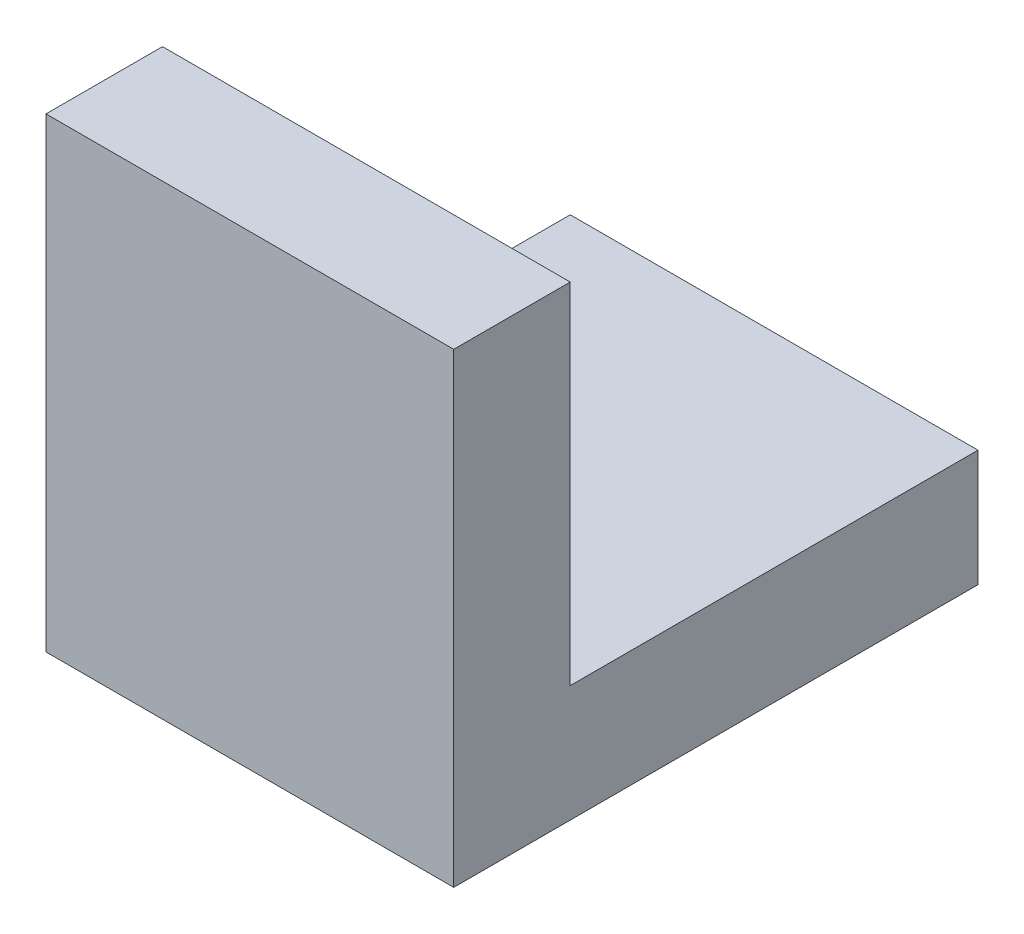
ISO-10303-21;
HEADER;
FILE_DESCRIPTION(('STEP AP214'),'2;1');
FILE_NAME('part.step','',(''),(''),'','','');
FILE_SCHEMA(('AUTOMOTIVE_DESIGN { 1 0 10303 214 1 1 1 1 }'));
ENDSEC;
DATA;
#1=APPLICATION_CONTEXT('core data for automotive mechanical design processes');
#2=APPLICATION_PROTOCOL_DEFINITION('international standard','automotive_design',2000,#1);
#3=PRODUCT_CONTEXT('',#1,'mechanical');
#4=PRODUCT('Part','Part','',(#3));
#5=PRODUCT_RELATED_PRODUCT_CATEGORY('part','',(#4));
#6=PRODUCT_DEFINITION_FORMATION('','',#4);
#7=PRODUCT_DEFINITION_CONTEXT('part definition',#1,'design');
#8=PRODUCT_DEFINITION('design','',#6,#7);
#9=PRODUCT_DEFINITION_SHAPE('','',#8);
#10=(LENGTH_UNIT() NAMED_UNIT(*) SI_UNIT(.MILLI.,.METRE.));
#11=(NAMED_UNIT(*) PLANE_ANGLE_UNIT() SI_UNIT($,.RADIAN.));
#12=(NAMED_UNIT(*) SI_UNIT($,.STERADIAN.) SOLID_ANGLE_UNIT());
#13=UNCERTAINTY_MEASURE_WITH_UNIT(LENGTH_MEASURE(1.E-05),#10,'distance_accuracy_value','');
#14=(GEOMETRIC_REPRESENTATION_CONTEXT(3) GLOBAL_UNCERTAINTY_ASSIGNED_CONTEXT((#13)) GLOBAL_UNIT_ASSIGNED_CONTEXT((#10,
#11,#12)) REPRESENTATION_CONTEXT('',''));
#15=CARTESIAN_POINT('',(0.,0.,0.));
#16=DIRECTION('',(0.,0.,1.));
#17=DIRECTION('',(1.,0.,0.));
#18=AXIS2_PLACEMENT_3D('',#15,#16,#17);
#19=CARTESIAN_POINT('',(7000.,0.,0.));
#20=DIRECTION('',(0.,1.,0.));
#21=DIRECTION('',(0.,0.,1.));
#22=AXIS2_PLACEMENT_3D('',#19,#20,#21);
#23=PLANE('',#22);
#24=DIRECTION('',(0.,0.,-1.));
#25=VECTOR('',#24,1.);
#26=CARTESIAN_POINT('',(0.,0.,0.));
#27=LINE('',#26,#25);
#28=CARTESIAN_POINT('',(0.,0.,0.));
#29=VERTEX_POINT('',#28);
#30=CARTESIAN_POINT('',(0.,0.,-9000.));
#31=VERTEX_POINT('',#30);
#32=EDGE_CURVE('E121',#29,#31,#27,.T.);
#33=ORIENTED_EDGE('',*,*,#32,.T.);
#34=DIRECTION('',(-1.,0.,0.));
#35=VECTOR('',#34,1.);
#36=CARTESIAN_POINT('',(7000.,0.,-9000.));
#37=LINE('',#36,#35);
#38=CARTESIAN_POINT('',(7000.,0.,-9000.));
#39=VERTEX_POINT('',#38);
#40=EDGE_CURVE('E11',#39,#31,#37,.T.);
#41=ORIENTED_EDGE('',*,*,#40,.F.);
#42=DIRECTION('',(0.,0.,-1.));
#43=VECTOR('',#42,1.);
#44=CARTESIAN_POINT('',(7000.,0.,0.));
#45=LINE('',#44,#43);
#46=CARTESIAN_POINT('',(7000.,0.,0.));
#47=VERTEX_POINT('',#46);
#48=EDGE_CURVE('E131',#47,#39,#45,.T.);
#49=ORIENTED_EDGE('',*,*,#48,.F.);
#50=DIRECTION('',(-1.,0.,0.));
#51=VECTOR('',#50,1.);
#52=CARTESIAN_POINT('',(7000.,0.,0.));
#53=LINE('',#52,#51);
#54=EDGE_CURVE('E117',#47,#29,#53,.T.);
#55=ORIENTED_EDGE('',*,*,#54,.T.);
#56=EDGE_LOOP('',(#33,#41,#49,#55));
#57=FACE_BOUND('',#56,.T.);
#58=ADVANCED_FACE('F37',(#57),#23,.F.);
#59=CARTESIAN_POINT('',(7000.,0.,-9000.));
#60=DIRECTION('',(0.,0.,1.));
#61=DIRECTION('',(1.,0.,0.));
#62=AXIS2_PLACEMENT_3D('',#59,#60,#61);
#63=PLANE('',#62);
#64=DIRECTION('',(0.,1.,0.));
#65=VECTOR('',#64,1.);
#66=CARTESIAN_POINT('',(0.,0.,-9000.));
#67=LINE('',#66,#65);
#68=CARTESIAN_POINT('',(0.,2000.,-9000.));
#69=VERTEX_POINT('',#68);
#70=EDGE_CURVE('E124',#31,#69,#67,.T.);
#71=ORIENTED_EDGE('',*,*,#70,.T.);
#72=DIRECTION('',(-1.,0.,0.));
#73=VECTOR('',#72,1.);
#74=CARTESIAN_POINT('',(7000.,2000.,-9000.));
#75=LINE('',#74,#73);
#76=CARTESIAN_POINT('',(7000.,2000.,-9000.));
#77=VERTEX_POINT('',#76);
#78=EDGE_CURVE('E45',#77,#69,#75,.T.);
#79=ORIENTED_EDGE('',*,*,#78,.F.);
#80=DIRECTION('',(0.,1.,0.));
#81=VECTOR('',#80,1.);
#82=CARTESIAN_POINT('',(7000.,0.,-9000.));
#83=LINE('',#82,#81);
#84=EDGE_CURVE('E90',#39,#77,#83,.T.);
#85=ORIENTED_EDGE('',*,*,#84,.F.);
#86=ORIENTED_EDGE('',*,*,#40,.T.);
#87=EDGE_LOOP('',(#71,#79,#85,#86));
#88=FACE_BOUND('',#87,.T.);
#89=ADVANCED_FACE('F155',(#88),#63,.F.);
#90=CARTESIAN_POINT('',(7000.,2000.,-9000.));
#91=DIRECTION('',(0.,-1.,0.));
#92=DIRECTION('',(0.,0.,-1.));
#93=AXIS2_PLACEMENT_3D('',#90,#91,#92);
#94=PLANE('',#93);
#95=DIRECTION('',(0.,0.,1.));
#96=VECTOR('',#95,1.);
#97=CARTESIAN_POINT('',(0.,2000.,-9000.));
#98=LINE('',#97,#96);
#99=CARTESIAN_POINT('',(0.,2000.,-2000.));
#100=VERTEX_POINT('',#99);
#101=EDGE_CURVE('E126',#69,#100,#98,.T.);
#102=ORIENTED_EDGE('',*,*,#101,.T.);
#103=DIRECTION('',(-1.,0.,0.));
#104=VECTOR('',#103,1.);
#105=CARTESIAN_POINT('',(7000.,2000.,-2000.));
#106=LINE('',#105,#104);
#107=CARTESIAN_POINT('',(7000.,2000.,-2000.));
#108=VERTEX_POINT('',#107);
#109=EDGE_CURVE('E112',#108,#100,#106,.T.);
#110=ORIENTED_EDGE('',*,*,#109,.F.);
#111=DIRECTION('',(0.,0.,1.));
#112=VECTOR('',#111,1.);
#113=CARTESIAN_POINT('',(7000.,2000.,-9000.));
#114=LINE('',#113,#112);
#115=EDGE_CURVE('E103',#77,#108,#114,.T.);
#116=ORIENTED_EDGE('',*,*,#115,.F.);
#117=ORIENTED_EDGE('',*,*,#78,.T.);
#118=EDGE_LOOP('',(#102,#110,#116,#117));
#119=FACE_BOUND('',#118,.T.);
#120=ADVANCED_FACE('F137',(#119),#94,.F.);
#121=CARTESIAN_POINT('',(7000.,2000.,-2000.));
#122=DIRECTION('',(0.,0.,1.));
#123=DIRECTION('',(1.,0.,0.));
#124=AXIS2_PLACEMENT_3D('',#121,#122,#123);
#125=PLANE('',#124);
#126=DIRECTION('',(0.,1.,0.));
#127=VECTOR('',#126,1.);
#128=CARTESIAN_POINT('',(0.,2000.,-2000.));
#129=LINE('',#128,#127);
#130=CARTESIAN_POINT('',(0.,8000.,-2000.));
#131=VERTEX_POINT('',#130);
#132=EDGE_CURVE('E111',#100,#131,#129,.T.);
#133=ORIENTED_EDGE('',*,*,#132,.T.);
#134=DIRECTION('',(-1.,0.,0.));
#135=VECTOR('',#134,1.);
#136=CARTESIAN_POINT('',(7000.,8000.,-2000.));
#137=LINE('',#136,#135);
#138=CARTESIAN_POINT('',(7000.,8000.,-2000.));
#139=VERTEX_POINT('',#138);
#140=EDGE_CURVE('E108',#139,#131,#137,.T.);
#141=ORIENTED_EDGE('',*,*,#140,.F.);
#142=DIRECTION('',(0.,1.,0.));
#143=VECTOR('',#142,1.);
#144=CARTESIAN_POINT('',(7000.,2000.,-2000.));
#145=LINE('',#144,#143);
#146=EDGE_CURVE('E97',#108,#139,#145,.T.);
#147=ORIENTED_EDGE('',*,*,#146,.F.);
#148=ORIENTED_EDGE('',*,*,#109,.T.);
#149=EDGE_LOOP('',(#133,#141,#147,#148));
#150=FACE_BOUND('',#149,.T.);
#151=ADVANCED_FACE('F109',(#150),#125,.F.);
#152=CARTESIAN_POINT('',(7000.,8000.,0.));
#153=DIRECTION('',(0.,-1.,0.));
#154=DIRECTION('',(0.,0.,-1.));
#155=AXIS2_PLACEMENT_3D('',#152,#153,#154);
#156=PLANE('',#155);
#157=DIRECTION('',(0.,0.,1.));
#158=VECTOR('',#157,1.);
#159=CARTESIAN_POINT('',(0.,8000.,0.));
#160=LINE('',#159,#158);
#161=CARTESIAN_POINT('',(0.,8000.,0.));
#162=VERTEX_POINT('',#161);
#163=EDGE_CURVE('E76',#131,#162,#160,.T.);
#164=ORIENTED_EDGE('',*,*,#163,.T.);
#165=DIRECTION('',(-1.,0.,0.));
#166=VECTOR('',#165,1.);
#167=CARTESIAN_POINT('',(7000.,8000.,0.));
#168=LINE('',#167,#166);
#169=CARTESIAN_POINT('',(7000.,8000.,0.));
#170=VERTEX_POINT('',#169);
#171=EDGE_CURVE('E113',#170,#162,#168,.T.);
#172=ORIENTED_EDGE('',*,*,#171,.F.);
#173=DIRECTION('',(0.,0.,1.));
#174=VECTOR('',#173,1.);
#175=CARTESIAN_POINT('',(7000.,8000.,0.));
#176=LINE('',#175,#174);
#177=EDGE_CURVE('E101',#139,#170,#176,.T.);
#178=ORIENTED_EDGE('',*,*,#177,.F.);
#179=ORIENTED_EDGE('',*,*,#140,.T.);
#180=EDGE_LOOP('',(#164,#172,#178,#179));
#181=FACE_BOUND('',#180,.T.);
#182=ADVANCED_FACE('F115',(#181),#156,.F.);
#183=CARTESIAN_POINT('',(7000.,0.,0.));
#184=DIRECTION('',(0.,0.,-1.));
#185=DIRECTION('',(-1.,0.,0.));
#186=AXIS2_PLACEMENT_3D('',#183,#184,#185);
#187=PLANE('',#186);
#188=DIRECTION('',(0.,-1.,0.));
#189=VECTOR('',#188,1.);
#190=CARTESIAN_POINT('',(0.,0.,0.));
#191=LINE('',#190,#189);
#192=EDGE_CURVE('E82',#162,#29,#191,.T.);
#193=ORIENTED_EDGE('',*,*,#192,.T.);
#194=ORIENTED_EDGE('',*,*,#54,.F.);
#195=DIRECTION('',(0.,-1.,0.));
#196=VECTOR('',#195,1.);
#197=CARTESIAN_POINT('',(7000.,0.,0.));
#198=LINE('',#197,#196);
#199=EDGE_CURVE('E53',#170,#47,#198,.T.);
#200=ORIENTED_EDGE('',*,*,#199,.F.);
#201=ORIENTED_EDGE('',*,*,#171,.T.);
#202=EDGE_LOOP('',(#193,#194,#200,#201));
#203=FACE_BOUND('',#202,.T.);
#204=ADVANCED_FACE('F144',(#203),#187,.F.);
#205=CARTESIAN_POINT('',(7000.,0.,0.));
#206=DIRECTION('',(1.,0.,0.));
#207=DIRECTION('',(0.,0.,-1.));
#208=AXIS2_PLACEMENT_3D('',#205,#206,#207);
#209=PLANE('',#208);
#210=ORIENTED_EDGE('',*,*,#48,.T.);
#211=ORIENTED_EDGE('',*,*,#84,.T.);
#212=ORIENTED_EDGE('',*,*,#115,.T.);
#213=ORIENTED_EDGE('',*,*,#146,.T.);
#214=ORIENTED_EDGE('',*,*,#177,.T.);
#215=ORIENTED_EDGE('',*,*,#199,.T.);
#216=EDGE_LOOP('',(#210,#211,#212,#213,#214,#215));
#217=FACE_BOUND('',#216,.T.);
#218=ADVANCED_FACE('F99',(#217),#209,.T.);
#219=CARTESIAN_POINT('',(0.,0.,0.));
#220=DIRECTION('',(1.,0.,0.));
#221=DIRECTION('',(0.,0.,-1.));
#222=AXIS2_PLACEMENT_3D('',#219,#220,#221);
#223=PLANE('',#222);
#224=ORIENTED_EDGE('',*,*,#32,.F.);
#225=ORIENTED_EDGE('',*,*,#192,.F.);
#226=ORIENTED_EDGE('',*,*,#163,.F.);
#227=ORIENTED_EDGE('',*,*,#132,.F.);
#228=ORIENTED_EDGE('',*,*,#101,.F.);
#229=ORIENTED_EDGE('',*,*,#70,.F.);
#230=EDGE_LOOP('',(#224,#225,#226,#227,#228,#229));
#231=FACE_BOUND('',#230,.T.);
#232=ADVANCED_FACE('F140',(#231),#223,.F.);
#233=CLOSED_SHELL('',(#58,#89,#120,#151,#182,#204,#218,#232));
#234=MANIFOLD_SOLID_BREP('B2',#233);
#235=ADVANCED_BREP_SHAPE_REPRESENTATION('',(#18,#234),#14);
#236=SHAPE_DEFINITION_REPRESENTATION(#9,#235);
ENDSEC;
END-ISO-10303-21;
